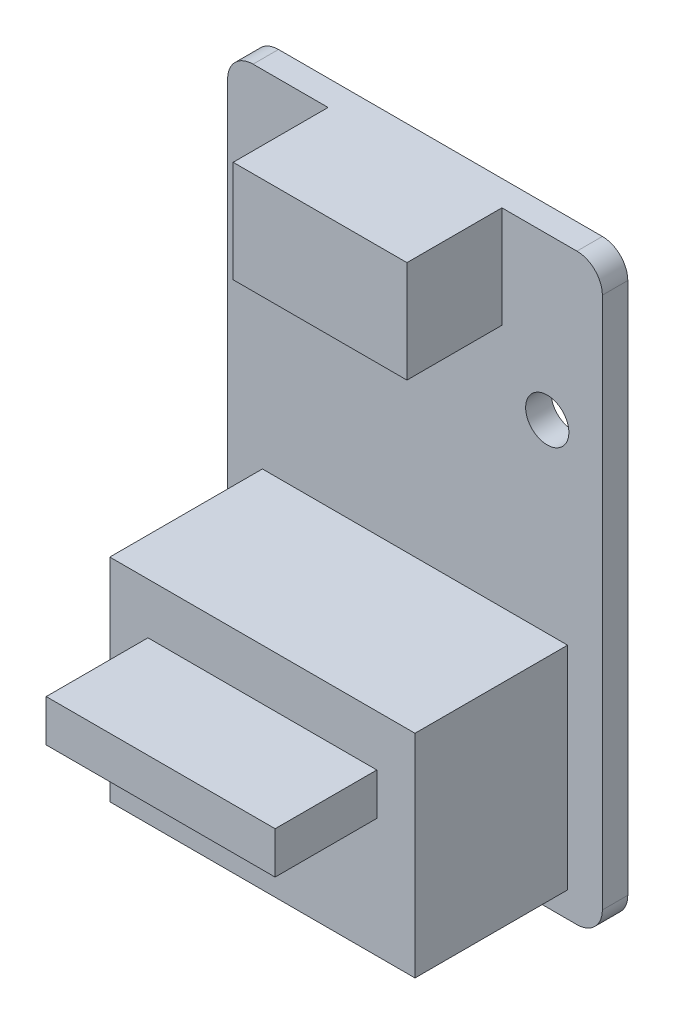
ISO-10303-21;
HEADER;
FILE_DESCRIPTION(('STEP AP214'),'2;1');
FILE_NAME('part.step','',(''),(''),'','','');
FILE_SCHEMA(('AUTOMOTIVE_DESIGN { 1 0 10303 214 1 1 1 1 }'));
ENDSEC;
DATA;
#1=APPLICATION_CONTEXT('core data for automotive mechanical design processes');
#2=APPLICATION_PROTOCOL_DEFINITION('international standard','automotive_design',2000,#1);
#3=PRODUCT_CONTEXT('',#1,'mechanical');
#4=PRODUCT('Part','Part','',(#3));
#5=PRODUCT_RELATED_PRODUCT_CATEGORY('part','',(#4));
#6=PRODUCT_DEFINITION_FORMATION('','',#4);
#7=PRODUCT_DEFINITION_CONTEXT('part definition',#1,'design');
#8=PRODUCT_DEFINITION('design','',#6,#7);
#9=PRODUCT_DEFINITION_SHAPE('','',#8);
#10=(LENGTH_UNIT() NAMED_UNIT(*) SI_UNIT(.MILLI.,.METRE.));
#11=(NAMED_UNIT(*) PLANE_ANGLE_UNIT() SI_UNIT($,.RADIAN.));
#12=(NAMED_UNIT(*) SI_UNIT($,.STERADIAN.) SOLID_ANGLE_UNIT());
#13=UNCERTAINTY_MEASURE_WITH_UNIT(LENGTH_MEASURE(1.E-05),#10,'distance_accuracy_value','');
#14=(GEOMETRIC_REPRESENTATION_CONTEXT(3) GLOBAL_UNCERTAINTY_ASSIGNED_CONTEXT((#13)) GLOBAL_UNIT_ASSIGNED_CONTEXT((#10,
#11,#12)) REPRESENTATION_CONTEXT('',''));
#15=CARTESIAN_POINT('',(0.,0.,0.));
#16=DIRECTION('',(0.,0.,1.));
#17=DIRECTION('',(1.,0.,0.));
#18=AXIS2_PLACEMENT_3D('',#15,#16,#17);
#19=CARTESIAN_POINT('',(12.3394044605913,-93.8719942988852,1.5));
#20=DIRECTION('',(0.,0.,1.));
#21=DIRECTION('',(1.,0.,0.));
#22=AXIS2_PLACEMENT_3D('',#19,#20,#21);
#23=PLANE('',#22);
#24=CARTESIAN_POINT('',(-5.01059553940873,-70.4719942988852,1.5));
#25=DIRECTION('',(0.,0.,1.));
#26=DIRECTION('',(1.,0.,0.));
#27=AXIS2_PLACEMENT_3D('',#24,#25,#26);
#28=CIRCLE('',#27,1.27499999999999);
#29=CARTESIAN_POINT('',(-3.73559553940874,-70.4719942988852,1.5));
#30=VERTEX_POINT('',#29);
#31=EDGE_CURVE('E356',#30,#30,#28,.T.);
#32=ORIENTED_EDGE('',*,*,#31,.F.);
#33=EDGE_LOOP('',(#32));
#34=FACE_BOUND('',#33,.T.);
#35=CARTESIAN_POINT('',(10.5894044605913,-70.4719942988852,1.5));
#36=DIRECTION('',(0.,0.,1.));
#37=DIRECTION('',(1.,0.,0.));
#38=AXIS2_PLACEMENT_3D('',#35,#36,#37);
#39=CIRCLE('',#38,1.27499999999999);
#40=CARTESIAN_POINT('',(11.8644044605913,-70.4719942988852,1.5));
#41=VERTEX_POINT('',#40);
#42=EDGE_CURVE('E350',#41,#41,#39,.T.);
#43=ORIENTED_EDGE('',*,*,#42,.F.);
#44=EDGE_LOOP('',(#43));
#45=FACE_BOUND('',#44,.T.);
#46=DIRECTION('',(0.,-1.,0.));
#47=VECTOR('',#46,1.);
#48=CARTESIAN_POINT('',(-6.21059553940872,-81.3719942988852,1.5));
#49=LINE('',#48,#47);
#50=CARTESIAN_POINT('',(-6.21059553940872,-81.3719942988852,1.5));
#51=VERTEX_POINT('',#50);
#52=CARTESIAN_POINT('',(-6.21059553940872,-93.8719942988852,1.5));
#53=VERTEX_POINT('',#52);
#54=EDGE_CURVE('E229',#51,#53,#49,.T.);
#55=ORIENTED_EDGE('',*,*,#54,.F.);
#56=DIRECTION('',(-1.,0.,0.));
#57=VECTOR('',#56,1.);
#58=CARTESIAN_POINT('',(-6.21059553940872,-81.3719942988852,1.5));
#59=LINE('',#58,#57);
#60=CARTESIAN_POINT('',(11.7894044605913,-81.3719942988852,1.5));
#61=VERTEX_POINT('',#60);
#62=EDGE_CURVE('E234',#61,#51,#59,.T.);
#63=ORIENTED_EDGE('',*,*,#62,.F.);
#64=DIRECTION('',(0.,1.,0.));
#65=VECTOR('',#64,1.);
#66=CARTESIAN_POINT('',(11.7894044605913,-81.3719942988852,1.5));
#67=LINE('',#66,#65);
#68=CARTESIAN_POINT('',(11.7894044605913,-93.8719942988852,1.5));
#69=VERTEX_POINT('',#68);
#70=EDGE_CURVE('E246',#69,#61,#67,.T.);
#71=ORIENTED_EDGE('',*,*,#70,.F.);
#72=DIRECTION('',(1.,0.,0.));
#73=VECTOR('',#72,1.);
#74=CARTESIAN_POINT('',(-6.21059553940872,-93.8719942988852,1.5));
#75=LINE('',#74,#73);
#76=EDGE_CURVE('E243',#53,#69,#75,.T.);
#77=ORIENTED_EDGE('',*,*,#76,.F.);
#78=EDGE_LOOP('',(#55,#63,#71,#77));
#79=FACE_BOUND('',#78,.T.);
#80=DIRECTION('',(1.,0.,0.));
#81=VECTOR('',#80,1.);
#82=CARTESIAN_POINT('',(-2.33559553940872,-66.9719942988852,1.5));
#83=LINE('',#82,#81);
#84=CARTESIAN_POINT('',(-2.33559553940872,-66.9719942988852,1.5));
#85=VERTEX_POINT('',#84);
#86=CARTESIAN_POINT('',(7.91440446059128,-66.9719942988852,1.5));
#87=VERTEX_POINT('',#86);
#88=EDGE_CURVE('E48',#85,#87,#83,.T.);
#89=ORIENTED_EDGE('',*,*,#88,.F.);
#90=DIRECTION('',(0.,-1.,0.));
#91=VECTOR('',#90,1.);
#92=CARTESIAN_POINT('',(-2.33559553940872,-60.9719942988852,1.5));
#93=LINE('',#92,#91);
#94=CARTESIAN_POINT('',(-2.33559553940872,-60.9719942988852,1.5));
#95=VERTEX_POINT('',#94);
#96=EDGE_CURVE('E190',#95,#85,#93,.T.);
#97=ORIENTED_EDGE('',*,*,#96,.F.);
#98=DIRECTION('',(-1.,0.,0.));
#99=VECTOR('',#98,1.);
#100=CARTESIAN_POINT('',(-6.76059553940872,-60.9719942988852,1.5));
#101=LINE('',#100,#99);
#102=CARTESIAN_POINT('',(-6.76059553940872,-60.9719942988852,1.5));
#103=VERTEX_POINT('',#102);
#104=EDGE_CURVE('E271',#95,#103,#101,.T.);
#105=ORIENTED_EDGE('',*,*,#104,.T.);
#106=CARTESIAN_POINT('',(-6.76059553940872,-62.4719942988852,1.5));
#107=DIRECTION('',(0.,0.,1.));
#108=DIRECTION('',(1.,0.,0.));
#109=AXIS2_PLACEMENT_3D('',#106,#107,#108);
#110=CIRCLE('',#109,1.5);
#111=CARTESIAN_POINT('',(-8.26059553940872,-62.4719942988852,1.5));
#112=VERTEX_POINT('',#111);
#113=EDGE_CURVE('E274',#103,#112,#110,.T.);
#114=ORIENTED_EDGE('',*,*,#113,.T.);
#115=DIRECTION('',(0.,-1.,0.));
#116=VECTOR('',#115,1.);
#117=CARTESIAN_POINT('',(-8.26059553940872,-62.4719942988852,1.5));
#118=LINE('',#117,#116);
#119=CARTESIAN_POINT('',(-8.26059553940872,-93.8719942988852,1.5));
#120=VERTEX_POINT('',#119);
#121=EDGE_CURVE('E276',#112,#120,#118,.T.);
#122=ORIENTED_EDGE('',*,*,#121,.T.);
#123=CARTESIAN_POINT('',(-6.76059553940872,-93.8719942988852,1.5));
#124=DIRECTION('',(0.,0.,1.));
#125=DIRECTION('',(1.,0.,0.));
#126=AXIS2_PLACEMENT_3D('',#123,#124,#125);
#127=CIRCLE('',#126,1.5);
#128=CARTESIAN_POINT('',(-6.76059553940872,-95.3719942988852,1.5));
#129=VERTEX_POINT('',#128);
#130=EDGE_CURVE('E278',#120,#129,#127,.T.);
#131=ORIENTED_EDGE('',*,*,#130,.T.);
#132=DIRECTION('',(1.,0.,0.));
#133=VECTOR('',#132,1.);
#134=CARTESIAN_POINT('',(-6.76059553940872,-95.3719942988852,1.5));
#135=LINE('',#134,#133);
#136=CARTESIAN_POINT('',(12.3394044605913,-95.3719942988852,1.5));
#137=VERTEX_POINT('',#136);
#138=EDGE_CURVE('E280',#129,#137,#135,.T.);
#139=ORIENTED_EDGE('',*,*,#138,.T.);
#140=CARTESIAN_POINT('',(12.3394044605913,-93.8719942988852,1.5));
#141=DIRECTION('',(0.,0.,1.));
#142=DIRECTION('',(1.,0.,0.));
#143=AXIS2_PLACEMENT_3D('',#140,#141,#142);
#144=CIRCLE('',#143,1.5);
#145=CARTESIAN_POINT('',(13.8394044605913,-93.8719942988852,1.5));
#146=VERTEX_POINT('',#145);
#147=EDGE_CURVE('E263',#137,#146,#144,.T.);
#148=ORIENTED_EDGE('',*,*,#147,.T.);
#149=DIRECTION('',(0.,1.,0.));
#150=VECTOR('',#149,1.);
#151=CARTESIAN_POINT('',(13.8394044605913,-62.4719942988852,1.5));
#152=LINE('',#151,#150);
#153=CARTESIAN_POINT('',(13.8394044605913,-62.4719942988852,1.5));
#154=VERTEX_POINT('',#153);
#155=EDGE_CURVE('E266',#146,#154,#152,.T.);
#156=ORIENTED_EDGE('',*,*,#155,.T.);
#157=CARTESIAN_POINT('',(12.3394044605913,-62.4719942988852,1.5));
#158=DIRECTION('',(0.,0.,1.));
#159=DIRECTION('',(-1.,0.,0.));
#160=AXIS2_PLACEMENT_3D('',#157,#158,#159);
#161=CIRCLE('',#160,1.5);
#162=CARTESIAN_POINT('',(12.3394044605913,-60.9719942988852,1.5));
#163=VERTEX_POINT('',#162);
#164=EDGE_CURVE('E269',#154,#163,#161,.T.);
#165=ORIENTED_EDGE('',*,*,#164,.T.);
#166=CARTESIAN_POINT('',(7.91440446059128,-60.9719942988852,1.5));
#167=VERTEX_POINT('',#166);
#168=EDGE_CURVE('E272',#163,#167,#101,.T.);
#169=ORIENTED_EDGE('',*,*,#168,.T.);
#170=DIRECTION('',(0.,1.,0.));
#171=VECTOR('',#170,1.);
#172=CARTESIAN_POINT('',(7.91440446059128,-60.9719942988852,1.5));
#173=LINE('',#172,#171);
#174=EDGE_CURVE('E53',#87,#167,#173,.T.);
#175=ORIENTED_EDGE('',*,*,#174,.F.);
#176=EDGE_LOOP('',(#89,#97,#105,#114,#122,#131,#139,#148,#156,#165,#169,#175));
#177=FACE_BOUND('',#176,.T.);
#178=ADVANCED_FACE('F33',(#34,#45,#79,#177),#23,.T.);
#179=CARTESIAN_POINT('',(12.3394044605913,-93.8719942988852,1.5));
#180=DIRECTION('',(0.,0.,-1.));
#181=DIRECTION('',(-1.,0.,0.));
#182=AXIS2_PLACEMENT_3D('',#179,#180,#181);
#183=CYLINDRICAL_SURFACE('',#182,1.5);
#184=CARTESIAN_POINT('',(12.3394044605913,-93.8719942988852,0.));
#185=DIRECTION('',(0.,0.,1.));
#186=DIRECTION('',(1.,0.,0.));
#187=AXIS2_PLACEMENT_3D('',#184,#185,#186);
#188=CIRCLE('',#187,1.5);
#189=CARTESIAN_POINT('',(12.3394044605913,-95.3719942988852,0.));
#190=VERTEX_POINT('',#189);
#191=CARTESIAN_POINT('',(13.8394044605913,-93.8719942988852,0.));
#192=VERTEX_POINT('',#191);
#193=EDGE_CURVE('E262',#190,#192,#188,.T.);
#194=ORIENTED_EDGE('',*,*,#193,.T.);
#195=DIRECTION('',(0.,0.,-1.));
#196=VECTOR('',#195,1.);
#197=CARTESIAN_POINT('',(13.8394044605913,-93.8719942988852,1.5));
#198=LINE('',#197,#196);
#199=EDGE_CURVE('E11',#146,#192,#198,.T.);
#200=ORIENTED_EDGE('',*,*,#199,.F.);
#201=ORIENTED_EDGE('',*,*,#147,.F.);
#202=DIRECTION('',(0.,0.,-1.));
#203=VECTOR('',#202,1.);
#204=CARTESIAN_POINT('',(12.3394044605913,-95.3719942988852,1.5));
#205=LINE('',#204,#203);
#206=EDGE_CURVE('E282',#137,#190,#205,.T.);
#207=ORIENTED_EDGE('',*,*,#206,.T.);
#208=EDGE_LOOP('',(#194,#200,#201,#207));
#209=FACE_BOUND('',#208,.T.);
#210=ADVANCED_FACE('F35',(#209),#183,.T.);
#211=CARTESIAN_POINT('',(13.8394044605913,-62.4719942988852,1.5));
#212=DIRECTION('',(-1.,0.,0.));
#213=DIRECTION('',(0.,-1.,0.));
#214=AXIS2_PLACEMENT_3D('',#211,#212,#213);
#215=PLANE('',#214);
#216=DIRECTION('',(0.,1.,0.));
#217=VECTOR('',#216,1.);
#218=CARTESIAN_POINT('',(13.8394044605913,-62.4719942988852,0.));
#219=LINE('',#218,#217);
#220=CARTESIAN_POINT('',(13.8394044605913,-62.4719942988852,0.));
#221=VERTEX_POINT('',#220);
#222=EDGE_CURVE('E285',#192,#221,#219,.T.);
#223=ORIENTED_EDGE('',*,*,#222,.T.);
#224=DIRECTION('',(0.,0.,-1.));
#225=VECTOR('',#224,1.);
#226=CARTESIAN_POINT('',(13.8394044605913,-62.4719942988852,1.5));
#227=LINE('',#226,#225);
#228=EDGE_CURVE('E41',#154,#221,#227,.T.);
#229=ORIENTED_EDGE('',*,*,#228,.F.);
#230=ORIENTED_EDGE('',*,*,#155,.F.);
#231=ORIENTED_EDGE('',*,*,#199,.T.);
#232=EDGE_LOOP('',(#223,#229,#230,#231));
#233=FACE_BOUND('',#232,.T.);
#234=ADVANCED_FACE('F414',(#233),#215,.F.);
#235=CARTESIAN_POINT('',(12.3394044605913,-62.4719942988852,1.5));
#236=DIRECTION('',(0.,0.,-1.));
#237=DIRECTION('',(-1.,0.,0.));
#238=AXIS2_PLACEMENT_3D('',#235,#236,#237);
#239=CYLINDRICAL_SURFACE('',#238,1.5);
#240=CARTESIAN_POINT('',(12.3394044605913,-62.4719942988852,0.));
#241=DIRECTION('',(0.,0.,1.));
#242=DIRECTION('',(-1.,0.,0.));
#243=AXIS2_PLACEMENT_3D('',#240,#241,#242);
#244=CIRCLE('',#243,1.5);
#245=CARTESIAN_POINT('',(12.3394044605913,-60.9719942988852,0.));
#246=VERTEX_POINT('',#245);
#247=EDGE_CURVE('E287',#221,#246,#244,.T.);
#248=ORIENTED_EDGE('',*,*,#247,.T.);
#249=DIRECTION('',(0.,0.,-1.));
#250=VECTOR('',#249,1.);
#251=CARTESIAN_POINT('',(12.3394044605913,-60.9719942988852,1.5));
#252=LINE('',#251,#250);
#253=EDGE_CURVE('E312',#163,#246,#252,.T.);
#254=ORIENTED_EDGE('',*,*,#253,.F.);
#255=ORIENTED_EDGE('',*,*,#164,.F.);
#256=ORIENTED_EDGE('',*,*,#228,.T.);
#257=EDGE_LOOP('',(#248,#254,#255,#256));
#258=FACE_BOUND('',#257,.T.);
#259=ADVANCED_FACE('F319',(#258),#239,.T.);
#260=CARTESIAN_POINT('',(-6.76059553940872,-60.9719942988852,1.5));
#261=DIRECTION('',(0.,-1.,0.));
#262=DIRECTION('',(0.,0.,-1.));
#263=AXIS2_PLACEMENT_3D('',#260,#261,#262);
#264=PLANE('',#263);
#265=DIRECTION('',(-1.,0.,0.));
#266=VECTOR('',#265,1.);
#267=CARTESIAN_POINT('',(-6.76059553940872,-60.9719942988852,0.));
#268=LINE('',#267,#266);
#269=CARTESIAN_POINT('',(-6.76059553940872,-60.9719942988852,0.));
#270=VERTEX_POINT('',#269);
#271=EDGE_CURVE('E289',#246,#270,#268,.T.);
#272=ORIENTED_EDGE('',*,*,#271,.T.);
#273=DIRECTION('',(0.,0.,-1.));
#274=VECTOR('',#273,1.);
#275=CARTESIAN_POINT('',(-6.76059553940872,-60.9719942988852,1.5));
#276=LINE('',#275,#274);
#277=EDGE_CURVE('E309',#103,#270,#276,.T.);
#278=ORIENTED_EDGE('',*,*,#277,.F.);
#279=ORIENTED_EDGE('',*,*,#104,.F.);
#280=DIRECTION('',(0.,0.,-1.));
#281=VECTOR('',#280,1.);
#282=CARTESIAN_POINT('',(-2.33559553940872,-60.9719942988852,7.1));
#283=LINE('',#282,#281);
#284=CARTESIAN_POINT('',(-2.33559553940872,-60.9719942988852,7.1));
#285=VERTEX_POINT('',#284);
#286=EDGE_CURVE('E338',#285,#95,#283,.T.);
#287=ORIENTED_EDGE('',*,*,#286,.F.);
#288=DIRECTION('',(-1.,0.,0.));
#289=VECTOR('',#288,1.);
#290=CARTESIAN_POINT('',(-2.33559553940872,-60.9719942988852,7.1));
#291=LINE('',#290,#289);
#292=CARTESIAN_POINT('',(7.91440446059128,-60.9719942988852,7.1));
#293=VERTEX_POINT('',#292);
#294=EDGE_CURVE('E184',#293,#285,#291,.T.);
#295=ORIENTED_EDGE('',*,*,#294,.F.);
#296=DIRECTION('',(0.,0.,-1.));
#297=VECTOR('',#296,1.);
#298=CARTESIAN_POINT('',(7.91440446059128,-60.9719942988852,7.1));
#299=LINE('',#298,#297);
#300=EDGE_CURVE('E196',#293,#167,#299,.T.);
#301=ORIENTED_EDGE('',*,*,#300,.T.);
#302=ORIENTED_EDGE('',*,*,#168,.F.);
#303=ORIENTED_EDGE('',*,*,#253,.T.);
#304=EDGE_LOOP('',(#272,#278,#279,#287,#295,#301,#302,#303));
#305=FACE_BOUND('',#304,.T.);
#306=ADVANCED_FACE('F330',(#305),#264,.F.);
#307=CARTESIAN_POINT('',(-6.76059553940872,-62.4719942988852,1.5));
#308=DIRECTION('',(0.,0.,-1.));
#309=DIRECTION('',(-1.,0.,0.));
#310=AXIS2_PLACEMENT_3D('',#307,#308,#309);
#311=CYLINDRICAL_SURFACE('',#310,1.5);
#312=CARTESIAN_POINT('',(-6.76059553940872,-62.4719942988852,0.));
#313=DIRECTION('',(0.,0.,1.));
#314=DIRECTION('',(1.,0.,0.));
#315=AXIS2_PLACEMENT_3D('',#312,#313,#314);
#316=CIRCLE('',#315,1.5);
#317=CARTESIAN_POINT('',(-8.26059553940872,-62.4719942988852,0.));
#318=VERTEX_POINT('',#317);
#319=EDGE_CURVE('E291',#270,#318,#316,.T.);
#320=ORIENTED_EDGE('',*,*,#319,.T.);
#321=DIRECTION('',(0.,0.,-1.));
#322=VECTOR('',#321,1.);
#323=CARTESIAN_POINT('',(-8.26059553940872,-62.4719942988852,1.5));
#324=LINE('',#323,#322);
#325=EDGE_CURVE('E306',#112,#318,#324,.T.);
#326=ORIENTED_EDGE('',*,*,#325,.F.);
#327=ORIENTED_EDGE('',*,*,#113,.F.);
#328=ORIENTED_EDGE('',*,*,#277,.T.);
#329=EDGE_LOOP('',(#320,#326,#327,#328));
#330=FACE_BOUND('',#329,.T.);
#331=ADVANCED_FACE('F334',(#330),#311,.T.);
#332=CARTESIAN_POINT('',(-8.26059553940872,-62.4719942988852,1.5));
#333=DIRECTION('',(1.,0.,0.));
#334=DIRECTION('',(0.,1.,0.));
#335=AXIS2_PLACEMENT_3D('',#332,#333,#334);
#336=PLANE('',#335);
#337=DIRECTION('',(0.,-1.,0.));
#338=VECTOR('',#337,1.);
#339=CARTESIAN_POINT('',(-8.26059553940872,-62.4719942988852,0.));
#340=LINE('',#339,#338);
#341=CARTESIAN_POINT('',(-8.26059553940872,-93.8719942988852,0.));
#342=VERTEX_POINT('',#341);
#343=EDGE_CURVE('E293',#318,#342,#340,.T.);
#344=ORIENTED_EDGE('',*,*,#343,.T.);
#345=DIRECTION('',(0.,0.,-1.));
#346=VECTOR('',#345,1.);
#347=CARTESIAN_POINT('',(-8.26059553940872,-93.8719942988852,1.5));
#348=LINE('',#347,#346);
#349=EDGE_CURVE('E303',#120,#342,#348,.T.);
#350=ORIENTED_EDGE('',*,*,#349,.F.);
#351=ORIENTED_EDGE('',*,*,#121,.F.);
#352=ORIENTED_EDGE('',*,*,#325,.T.);
#353=EDGE_LOOP('',(#344,#350,#351,#352));
#354=FACE_BOUND('',#353,.T.);
#355=ADVANCED_FACE('F404',(#354),#336,.F.);
#356=CARTESIAN_POINT('',(-6.76059553940872,-93.8719942988852,1.5));
#357=DIRECTION('',(0.,0.,-1.));
#358=DIRECTION('',(-1.,0.,0.));
#359=AXIS2_PLACEMENT_3D('',#356,#357,#358);
#360=CYLINDRICAL_SURFACE('',#359,1.5);
#361=CARTESIAN_POINT('',(-6.76059553940872,-93.8719942988852,0.));
#362=DIRECTION('',(0.,0.,1.));
#363=DIRECTION('',(1.,0.,0.));
#364=AXIS2_PLACEMENT_3D('',#361,#362,#363);
#365=CIRCLE('',#364,1.5);
#366=CARTESIAN_POINT('',(-6.76059553940872,-95.3719942988852,0.));
#367=VERTEX_POINT('',#366);
#368=EDGE_CURVE('E295',#342,#367,#365,.T.);
#369=ORIENTED_EDGE('',*,*,#368,.T.);
#370=DIRECTION('',(0.,0.,-1.));
#371=VECTOR('',#370,1.);
#372=CARTESIAN_POINT('',(-6.76059553940872,-95.3719942988852,1.5));
#373=LINE('',#372,#371);
#374=EDGE_CURVE('E300',#129,#367,#373,.T.);
#375=ORIENTED_EDGE('',*,*,#374,.F.);
#376=ORIENTED_EDGE('',*,*,#130,.F.);
#377=ORIENTED_EDGE('',*,*,#349,.T.);
#378=EDGE_LOOP('',(#369,#375,#376,#377));
#379=FACE_BOUND('',#378,.T.);
#380=ADVANCED_FACE('F400',(#379),#360,.T.);
#381=CARTESIAN_POINT('',(-6.76059553940872,-95.3719942988852,1.5));
#382=DIRECTION('',(0.,1.,0.));
#383=DIRECTION('',(0.,0.,1.));
#384=AXIS2_PLACEMENT_3D('',#381,#382,#383);
#385=PLANE('',#384);
#386=DIRECTION('',(1.,0.,0.));
#387=VECTOR('',#386,1.);
#388=CARTESIAN_POINT('',(-6.76059553940872,-95.3719942988852,0.));
#389=LINE('',#388,#387);
#390=EDGE_CURVE('E267',#367,#190,#389,.T.);
#391=ORIENTED_EDGE('',*,*,#390,.T.);
#392=ORIENTED_EDGE('',*,*,#206,.F.);
#393=ORIENTED_EDGE('',*,*,#138,.F.);
#394=ORIENTED_EDGE('',*,*,#374,.T.);
#395=EDGE_LOOP('',(#391,#392,#393,#394));
#396=FACE_BOUND('',#395,.T.);
#397=ADVANCED_FACE('F396',(#396),#385,.F.);
#398=CARTESIAN_POINT('',(12.3394044605913,-93.8719942988852,0.));
#399=DIRECTION('',(0.,0.,1.));
#400=DIRECTION('',(1.,0.,0.));
#401=AXIS2_PLACEMENT_3D('',#398,#399,#400);
#402=PLANE('',#401);
#403=CARTESIAN_POINT('',(-5.01059553940873,-70.4719942988852,0.));
#404=DIRECTION('',(0.,0.,1.));
#405=DIRECTION('',(1.,0.,0.));
#406=AXIS2_PLACEMENT_3D('',#403,#404,#405);
#407=CIRCLE('',#406,1.275);
#408=CARTESIAN_POINT('',(-3.73559553940873,-70.4719942988852,0.));
#409=VERTEX_POINT('',#408);
#410=EDGE_CURVE('E353',#409,#409,#407,.T.);
#411=ORIENTED_EDGE('',*,*,#410,.T.);
#412=EDGE_LOOP('',(#411));
#413=FACE_BOUND('',#412,.T.);
#414=CARTESIAN_POINT('',(10.5894044605913,-70.4719942988852,0.));
#415=DIRECTION('',(0.,0.,1.));
#416=DIRECTION('',(1.,0.,0.));
#417=AXIS2_PLACEMENT_3D('',#414,#415,#416);
#418=CIRCLE('',#417,1.275);
#419=CARTESIAN_POINT('',(11.8644044605913,-70.4719942988852,0.));
#420=VERTEX_POINT('',#419);
#421=EDGE_CURVE('E345',#420,#420,#418,.T.);
#422=ORIENTED_EDGE('',*,*,#421,.T.);
#423=EDGE_LOOP('',(#422));
#424=FACE_BOUND('',#423,.T.);
#425=ORIENTED_EDGE('',*,*,#193,.F.);
#426=ORIENTED_EDGE('',*,*,#390,.F.);
#427=ORIENTED_EDGE('',*,*,#368,.F.);
#428=ORIENTED_EDGE('',*,*,#343,.F.);
#429=ORIENTED_EDGE('',*,*,#319,.F.);
#430=ORIENTED_EDGE('',*,*,#271,.F.);
#431=ORIENTED_EDGE('',*,*,#247,.F.);
#432=ORIENTED_EDGE('',*,*,#222,.F.);
#433=EDGE_LOOP('',(#425,#426,#427,#428,#429,#430,#431,#432));
#434=FACE_BOUND('',#433,.T.);
#435=ADVANCED_FACE('F325',(#413,#424,#434),#402,.F.);
#436=CARTESIAN_POINT('',(-6.21059553940872,-81.3719942988852,10.5));
#437=DIRECTION('',(1.,0.,0.));
#438=DIRECTION('',(0.,1.,0.));
#439=AXIS2_PLACEMENT_3D('',#436,#437,#438);
#440=PLANE('',#439);
#441=ORIENTED_EDGE('',*,*,#54,.T.);
#442=DIRECTION('',(0.,0.,-1.));
#443=VECTOR('',#442,1.);
#444=CARTESIAN_POINT('',(-6.21059553940872,-93.8719942988852,10.5));
#445=LINE('',#444,#443);
#446=CARTESIAN_POINT('',(-6.21059553940872,-93.8719942988852,10.5));
#447=VERTEX_POINT('',#446);
#448=EDGE_CURVE('E259',#447,#53,#445,.T.);
#449=ORIENTED_EDGE('',*,*,#448,.F.);
#450=DIRECTION('',(0.,-1.,0.));
#451=VECTOR('',#450,1.);
#452=CARTESIAN_POINT('',(-6.21059553940872,-81.3719942988852,10.5));
#453=LINE('',#452,#451);
#454=CARTESIAN_POINT('',(-6.21059553940872,-81.3719942988852,10.5));
#455=VERTEX_POINT('',#454);
#456=EDGE_CURVE('E230',#455,#447,#453,.T.);
#457=ORIENTED_EDGE('',*,*,#456,.F.);
#458=DIRECTION('',(0.,0.,-1.));
#459=VECTOR('',#458,1.);
#460=CARTESIAN_POINT('',(-6.21059553940872,-81.3719942988852,10.5));
#461=LINE('',#460,#459);
#462=EDGE_CURVE('E240',#455,#51,#461,.T.);
#463=ORIENTED_EDGE('',*,*,#462,.T.);
#464=EDGE_LOOP('',(#441,#449,#457,#463));
#465=FACE_BOUND('',#464,.T.);
#466=ADVANCED_FACE('F375',(#465),#440,.F.);
#467=CARTESIAN_POINT('',(-6.21059553940872,-93.8719942988852,10.5));
#468=DIRECTION('',(0.,1.,0.));
#469=DIRECTION('',(0.,0.,1.));
#470=AXIS2_PLACEMENT_3D('',#467,#468,#469);
#471=PLANE('',#470);
#472=ORIENTED_EDGE('',*,*,#76,.T.);
#473=DIRECTION('',(0.,0.,-1.));
#474=VECTOR('',#473,1.);
#475=CARTESIAN_POINT('',(11.7894044605913,-93.8719942988852,10.5));
#476=LINE('',#475,#474);
#477=CARTESIAN_POINT('',(11.7894044605913,-93.8719942988852,10.5));
#478=VERTEX_POINT('',#477);
#479=EDGE_CURVE('E256',#478,#69,#476,.T.);
#480=ORIENTED_EDGE('',*,*,#479,.F.);
#481=DIRECTION('',(1.,0.,0.));
#482=VECTOR('',#481,1.);
#483=CARTESIAN_POINT('',(-6.21059553940872,-93.8719942988852,10.5));
#484=LINE('',#483,#482);
#485=EDGE_CURVE('E233',#447,#478,#484,.T.);
#486=ORIENTED_EDGE('',*,*,#485,.F.);
#487=ORIENTED_EDGE('',*,*,#448,.T.);
#488=EDGE_LOOP('',(#472,#480,#486,#487));
#489=FACE_BOUND('',#488,.T.);
#490=ADVANCED_FACE('F383',(#489),#471,.F.);
#491=CARTESIAN_POINT('',(11.7894044605913,-81.3719942988852,10.5));
#492=DIRECTION('',(-1.,0.,0.));
#493=DIRECTION('',(0.,-1.,0.));
#494=AXIS2_PLACEMENT_3D('',#491,#492,#493);
#495=PLANE('',#494);
#496=ORIENTED_EDGE('',*,*,#70,.T.);
#497=DIRECTION('',(0.,0.,-1.));
#498=VECTOR('',#497,1.);
#499=CARTESIAN_POINT('',(11.7894044605913,-81.3719942988852,10.5));
#500=LINE('',#499,#498);
#501=CARTESIAN_POINT('',(11.7894044605913,-81.3719942988852,10.5));
#502=VERTEX_POINT('',#501);
#503=EDGE_CURVE('E253',#502,#61,#500,.T.);
#504=ORIENTED_EDGE('',*,*,#503,.F.);
#505=DIRECTION('',(0.,1.,0.));
#506=VECTOR('',#505,1.);
#507=CARTESIAN_POINT('',(11.7894044605913,-81.3719942988852,10.5));
#508=LINE('',#507,#506);
#509=EDGE_CURVE('E236',#478,#502,#508,.T.);
#510=ORIENTED_EDGE('',*,*,#509,.F.);
#511=ORIENTED_EDGE('',*,*,#479,.T.);
#512=EDGE_LOOP('',(#496,#504,#510,#511));
#513=FACE_BOUND('',#512,.T.);
#514=ADVANCED_FACE('F381',(#513),#495,.F.);
#515=CARTESIAN_POINT('',(-6.21059553940872,-81.3719942988852,10.5));
#516=DIRECTION('',(0.,-1.,0.));
#517=DIRECTION('',(0.,0.,-1.));
#518=AXIS2_PLACEMENT_3D('',#515,#516,#517);
#519=PLANE('',#518);
#520=ORIENTED_EDGE('',*,*,#62,.T.);
#521=ORIENTED_EDGE('',*,*,#462,.F.);
#522=DIRECTION('',(-1.,0.,0.));
#523=VECTOR('',#522,1.);
#524=CARTESIAN_POINT('',(-6.21059553940872,-81.3719942988852,10.5));
#525=LINE('',#524,#523);
#526=EDGE_CURVE('E238',#502,#455,#525,.T.);
#527=ORIENTED_EDGE('',*,*,#526,.F.);
#528=ORIENTED_EDGE('',*,*,#503,.T.);
#529=EDGE_LOOP('',(#520,#521,#527,#528));
#530=FACE_BOUND('',#529,.T.);
#531=ADVANCED_FACE('F371',(#530),#519,.F.);
#532=CARTESIAN_POINT('',(0.,0.,10.5));
#533=DIRECTION('',(0.,0.,1.));
#534=DIRECTION('',(1.,0.,0.));
#535=AXIS2_PLACEMENT_3D('',#532,#533,#534);
#536=PLANE('',#535);
#537=DIRECTION('',(0.,-1.,0.));
#538=VECTOR('',#537,1.);
#539=CARTESIAN_POINT('',(-3.96059553940872,-84.3719942988852,10.5));
#540=LINE('',#539,#538);
#541=CARTESIAN_POINT('',(-3.96059553940872,-84.3719942988852,10.5));
#542=VERTEX_POINT('',#541);
#543=CARTESIAN_POINT('',(-3.96059553940872,-86.8442356585348,10.5));
#544=VERTEX_POINT('',#543);
#545=EDGE_CURVE('E191',#542,#544,#540,.T.);
#546=ORIENTED_EDGE('',*,*,#545,.F.);
#547=DIRECTION('',(-1.,0.,0.));
#548=VECTOR('',#547,1.);
#549=CARTESIAN_POINT('',(-3.96059553940872,-84.3719942988852,10.5));
#550=LINE('',#549,#548);
#551=CARTESIAN_POINT('',(9.53940446059128,-84.3719942988852,10.5));
#552=VERTEX_POINT('',#551);
#553=EDGE_CURVE('E204',#552,#542,#550,.T.);
#554=ORIENTED_EDGE('',*,*,#553,.F.);
#555=DIRECTION('',(0.,1.,0.));
#556=VECTOR('',#555,1.);
#557=CARTESIAN_POINT('',(9.53940446059128,-84.3719942988852,10.5));
#558=LINE('',#557,#556);
#559=CARTESIAN_POINT('',(9.53940446059128,-86.8442356585348,10.5));
#560=VERTEX_POINT('',#559);
#561=EDGE_CURVE('E213',#560,#552,#558,.T.);
#562=ORIENTED_EDGE('',*,*,#561,.F.);
#563=DIRECTION('',(1.,0.,0.));
#564=VECTOR('',#563,1.);
#565=CARTESIAN_POINT('',(-3.96059553940872,-86.8442356585348,10.5));
#566=LINE('',#565,#564);
#567=EDGE_CURVE('E194',#544,#560,#566,.T.);
#568=ORIENTED_EDGE('',*,*,#567,.F.);
#569=EDGE_LOOP('',(#546,#554,#562,#568));
#570=FACE_BOUND('',#569,.T.);
#571=ORIENTED_EDGE('',*,*,#456,.T.);
#572=ORIENTED_EDGE('',*,*,#485,.T.);
#573=ORIENTED_EDGE('',*,*,#509,.T.);
#574=ORIENTED_EDGE('',*,*,#526,.T.);
#575=EDGE_LOOP('',(#571,#572,#573,#574));
#576=FACE_BOUND('',#575,.T.);
#577=ADVANCED_FACE('F377',(#570,#576),#536,.T.);
#578=CARTESIAN_POINT('',(-3.96059553940872,-84.3719942988852,16.5));
#579=DIRECTION('',(1.,0.,0.));
#580=DIRECTION('',(0.,0.,-1.));
#581=AXIS2_PLACEMENT_3D('',#578,#579,#580);
#582=PLANE('',#581);
#583=ORIENTED_EDGE('',*,*,#545,.T.);
#584=DIRECTION('',(0.,0.,-1.));
#585=VECTOR('',#584,1.);
#586=CARTESIAN_POINT('',(-3.96059553940872,-86.8442356585348,16.5));
#587=LINE('',#586,#585);
#588=CARTESIAN_POINT('',(-3.96059553940872,-86.8442356585348,16.5));
#589=VERTEX_POINT('',#588);
#590=EDGE_CURVE('E226',#589,#544,#587,.T.);
#591=ORIENTED_EDGE('',*,*,#590,.F.);
#592=DIRECTION('',(0.,-1.,0.));
#593=VECTOR('',#592,1.);
#594=CARTESIAN_POINT('',(-3.96059553940872,-84.3719942988852,16.5));
#595=LINE('',#594,#593);
#596=CARTESIAN_POINT('',(-3.96059553940872,-84.3719942988852,16.5));
#597=VERTEX_POINT('',#596);
#598=EDGE_CURVE('E200',#597,#589,#595,.T.);
#599=ORIENTED_EDGE('',*,*,#598,.F.);
#600=DIRECTION('',(0.,0.,-1.));
#601=VECTOR('',#600,1.);
#602=CARTESIAN_POINT('',(-3.96059553940872,-84.3719942988852,16.5));
#603=LINE('',#602,#601);
#604=EDGE_CURVE('E209',#597,#542,#603,.T.);
#605=ORIENTED_EDGE('',*,*,#604,.T.);
#606=EDGE_LOOP('',(#583,#591,#599,#605));
#607=FACE_BOUND('',#606,.T.);
#608=ADVANCED_FACE('F459',(#607),#582,.F.);
#609=CARTESIAN_POINT('',(-3.96059553940872,-86.8442356585348,16.5));
#610=DIRECTION('',(0.,1.,0.));
#611=DIRECTION('',(0.,0.,1.));
#612=AXIS2_PLACEMENT_3D('',#609,#610,#611);
#613=PLANE('',#612);
#614=ORIENTED_EDGE('',*,*,#567,.T.);
#615=DIRECTION('',(0.,0.,-1.));
#616=VECTOR('',#615,1.);
#617=CARTESIAN_POINT('',(9.53940446059128,-86.8442356585348,16.5));
#618=LINE('',#617,#616);
#619=CARTESIAN_POINT('',(9.53940446059128,-86.8442356585348,16.5));
#620=VERTEX_POINT('',#619);
#621=EDGE_CURVE('E223',#620,#560,#618,.T.);
#622=ORIENTED_EDGE('',*,*,#621,.F.);
#623=DIRECTION('',(1.,0.,0.));
#624=VECTOR('',#623,1.);
#625=CARTESIAN_POINT('',(-3.96059553940872,-86.8442356585348,16.5));
#626=LINE('',#625,#624);
#627=EDGE_CURVE('E203',#589,#620,#626,.T.);
#628=ORIENTED_EDGE('',*,*,#627,.F.);
#629=ORIENTED_EDGE('',*,*,#590,.T.);
#630=EDGE_LOOP('',(#614,#622,#628,#629));
#631=FACE_BOUND('',#630,.T.);
#632=ADVANCED_FACE('F455',(#631),#613,.F.);
#633=CARTESIAN_POINT('',(9.53940446059128,-84.3719942988852,16.5));
#634=DIRECTION('',(-1.,0.,0.));
#635=DIRECTION('',(0.,-1.,0.));
#636=AXIS2_PLACEMENT_3D('',#633,#634,#635);
#637=PLANE('',#636);
#638=ORIENTED_EDGE('',*,*,#561,.T.);
#639=DIRECTION('',(0.,0.,-1.));
#640=VECTOR('',#639,1.);
#641=CARTESIAN_POINT('',(9.53940446059128,-84.3719942988852,16.5));
#642=LINE('',#641,#640);
#643=CARTESIAN_POINT('',(9.53940446059128,-84.3719942988852,16.5));
#644=VERTEX_POINT('',#643);
#645=EDGE_CURVE('E220',#644,#552,#642,.T.);
#646=ORIENTED_EDGE('',*,*,#645,.F.);
#647=DIRECTION('',(0.,1.,0.));
#648=VECTOR('',#647,1.);
#649=CARTESIAN_POINT('',(9.53940446059128,-84.3719942988852,16.5));
#650=LINE('',#649,#648);
#651=EDGE_CURVE('E206',#620,#644,#650,.T.);
#652=ORIENTED_EDGE('',*,*,#651,.F.);
#653=ORIENTED_EDGE('',*,*,#621,.T.);
#654=EDGE_LOOP('',(#638,#646,#652,#653));
#655=FACE_BOUND('',#654,.T.);
#656=ADVANCED_FACE('F451',(#655),#637,.F.);
#657=CARTESIAN_POINT('',(-3.96059553940872,-84.3719942988852,16.5));
#658=DIRECTION('',(0.,-1.,0.));
#659=DIRECTION('',(0.,0.,-1.));
#660=AXIS2_PLACEMENT_3D('',#657,#658,#659);
#661=PLANE('',#660);
#662=ORIENTED_EDGE('',*,*,#553,.T.);
#663=ORIENTED_EDGE('',*,*,#604,.F.);
#664=DIRECTION('',(-1.,0.,0.));
#665=VECTOR('',#664,1.);
#666=CARTESIAN_POINT('',(-3.96059553940872,-84.3719942988852,16.5));
#667=LINE('',#666,#665);
#668=EDGE_CURVE('E208',#644,#597,#667,.T.);
#669=ORIENTED_EDGE('',*,*,#668,.F.);
#670=ORIENTED_EDGE('',*,*,#645,.T.);
#671=EDGE_LOOP('',(#662,#663,#669,#670));
#672=FACE_BOUND('',#671,.T.);
#673=ADVANCED_FACE('F447',(#672),#661,.F.);
#674=CARTESIAN_POINT('',(0.,0.,16.5));
#675=DIRECTION('',(0.,0.,1.));
#676=DIRECTION('',(1.,0.,0.));
#677=AXIS2_PLACEMENT_3D('',#674,#675,#676);
#678=PLANE('',#677);
#679=ORIENTED_EDGE('',*,*,#598,.T.);
#680=ORIENTED_EDGE('',*,*,#627,.T.);
#681=ORIENTED_EDGE('',*,*,#651,.T.);
#682=ORIENTED_EDGE('',*,*,#668,.T.);
#683=EDGE_LOOP('',(#679,#680,#681,#682));
#684=FACE_BOUND('',#683,.T.);
#685=ADVANCED_FACE('F444',(#684),#678,.T.);
#686=CARTESIAN_POINT('',(-2.33559553940872,-60.9719942988852,7.1));
#687=DIRECTION('',(1.,0.,0.));
#688=DIRECTION('',(0.,1.,0.));
#689=AXIS2_PLACEMENT_3D('',#686,#687,#688);
#690=PLANE('',#689);
#691=ORIENTED_EDGE('',*,*,#96,.T.);
#692=DIRECTION('',(0.,0.,-1.));
#693=VECTOR('',#692,1.);
#694=CARTESIAN_POINT('',(-2.33559553940872,-66.9719942988852,7.1));
#695=LINE('',#694,#693);
#696=CARTESIAN_POINT('',(-2.33559553940872,-66.9719942988852,7.1));
#697=VERTEX_POINT('',#696);
#698=EDGE_CURVE('E172',#697,#85,#695,.T.);
#699=ORIENTED_EDGE('',*,*,#698,.F.);
#700=DIRECTION('',(0.,-1.,0.));
#701=VECTOR('',#700,1.);
#702=CARTESIAN_POINT('',(-2.33559553940872,-60.9719942988852,7.1));
#703=LINE('',#702,#701);
#704=EDGE_CURVE('E179',#285,#697,#703,.T.);
#705=ORIENTED_EDGE('',*,*,#704,.F.);
#706=ORIENTED_EDGE('',*,*,#286,.T.);
#707=EDGE_LOOP('',(#691,#699,#705,#706));
#708=FACE_BOUND('',#707,.T.);
#709=ADVANCED_FACE('F189',(#708),#690,.F.);
#710=CARTESIAN_POINT('',(-2.33559553940872,-66.9719942988852,7.1));
#711=DIRECTION('',(0.,1.,0.));
#712=DIRECTION('',(0.,0.,1.));
#713=AXIS2_PLACEMENT_3D('',#710,#711,#712);
#714=PLANE('',#713);
#715=ORIENTED_EDGE('',*,*,#88,.T.);
#716=DIRECTION('',(0.,0.,-1.));
#717=VECTOR('',#716,1.);
#718=CARTESIAN_POINT('',(7.91440446059128,-66.9719942988852,7.1));
#719=LINE('',#718,#717);
#720=CARTESIAN_POINT('',(7.91440446059128,-66.9719942988852,7.1));
#721=VERTEX_POINT('',#720);
#722=EDGE_CURVE('E175',#721,#87,#719,.T.);
#723=ORIENTED_EDGE('',*,*,#722,.F.);
#724=DIRECTION('',(1.,0.,0.));
#725=VECTOR('',#724,1.);
#726=CARTESIAN_POINT('',(-2.33559553940872,-66.9719942988852,7.1));
#727=LINE('',#726,#725);
#728=EDGE_CURVE('E168',#697,#721,#727,.T.);
#729=ORIENTED_EDGE('',*,*,#728,.F.);
#730=ORIENTED_EDGE('',*,*,#698,.T.);
#731=EDGE_LOOP('',(#715,#723,#729,#730));
#732=FACE_BOUND('',#731,.T.);
#733=ADVANCED_FACE('F170',(#732),#714,.F.);
#734=CARTESIAN_POINT('',(7.91440446059128,-60.9719942988852,7.1));
#735=DIRECTION('',(-1.,0.,0.));
#736=DIRECTION('',(0.,0.,1.));
#737=AXIS2_PLACEMENT_3D('',#734,#735,#736);
#738=PLANE('',#737);
#739=ORIENTED_EDGE('',*,*,#174,.T.);
#740=ORIENTED_EDGE('',*,*,#300,.F.);
#741=DIRECTION('',(0.,1.,0.));
#742=VECTOR('',#741,1.);
#743=CARTESIAN_POINT('',(7.91440446059128,-60.9719942988852,7.1));
#744=LINE('',#743,#742);
#745=EDGE_CURVE('E178',#721,#293,#744,.T.);
#746=ORIENTED_EDGE('',*,*,#745,.F.);
#747=ORIENTED_EDGE('',*,*,#722,.T.);
#748=EDGE_LOOP('',(#739,#740,#746,#747));
#749=FACE_BOUND('',#748,.T.);
#750=ADVANCED_FACE('F430',(#749),#738,.F.);
#751=CARTESIAN_POINT('',(0.,0.,7.1));
#752=DIRECTION('',(0.,0.,1.));
#753=DIRECTION('',(1.,0.,0.));
#754=AXIS2_PLACEMENT_3D('',#751,#752,#753);
#755=PLANE('',#754);
#756=ORIENTED_EDGE('',*,*,#704,.T.);
#757=ORIENTED_EDGE('',*,*,#728,.T.);
#758=ORIENTED_EDGE('',*,*,#745,.T.);
#759=ORIENTED_EDGE('',*,*,#294,.T.);
#760=EDGE_LOOP('',(#756,#757,#758,#759));
#761=FACE_BOUND('',#760,.T.);
#762=ADVANCED_FACE('F182',(#761),#755,.T.);
#763=CARTESIAN_POINT('',(10.5894044605913,-70.4719942988852,1.5));
#764=DIRECTION('',(0.,0.,1.));
#765=DIRECTION('',(1.,0.,0.));
#766=AXIS2_PLACEMENT_3D('',#763,#764,#765);
#767=CYLINDRICAL_SURFACE('',#766,1.27499999999999);
#768=ORIENTED_EDGE('',*,*,#421,.F.);
#769=EDGE_LOOP('',(#768));
#770=FACE_BOUND('',#769,.T.);
#771=ORIENTED_EDGE('',*,*,#42,.T.);
#772=EDGE_LOOP('',(#771));
#773=FACE_BOUND('',#772,.T.);
#774=ADVANCED_FACE('F437',(#770,#773),#767,.F.);
#775=CARTESIAN_POINT('',(-5.01059553940873,-70.4719942988852,1.5));
#776=DIRECTION('',(0.,0.,1.));
#777=DIRECTION('',(1.,0.,0.));
#778=AXIS2_PLACEMENT_3D('',#775,#776,#777);
#779=CYLINDRICAL_SURFACE('',#778,1.27499999999999);
#780=ORIENTED_EDGE('',*,*,#410,.F.);
#781=EDGE_LOOP('',(#780));
#782=FACE_BOUND('',#781,.T.);
#783=ORIENTED_EDGE('',*,*,#31,.T.);
#784=EDGE_LOOP('',(#783));
#785=FACE_BOUND('',#784,.T.);
#786=ADVANCED_FACE('F360',(#782,#785),#779,.F.);
#787=CLOSED_SHELL('',(#178,#210,#234,#259,#306,#331,#355,#380,#397,#435,#466,#490,#514,#531,
#577,#608,#632,#656,#673,#685,#709,#733,#750,#762,#774,#786));
#788=MANIFOLD_SOLID_BREP('B2',#787);
#789=ADVANCED_BREP_SHAPE_REPRESENTATION('',(#18,#788),#14);
#790=SHAPE_DEFINITION_REPRESENTATION(#9,#789);
ENDSEC;
END-ISO-10303-21;
